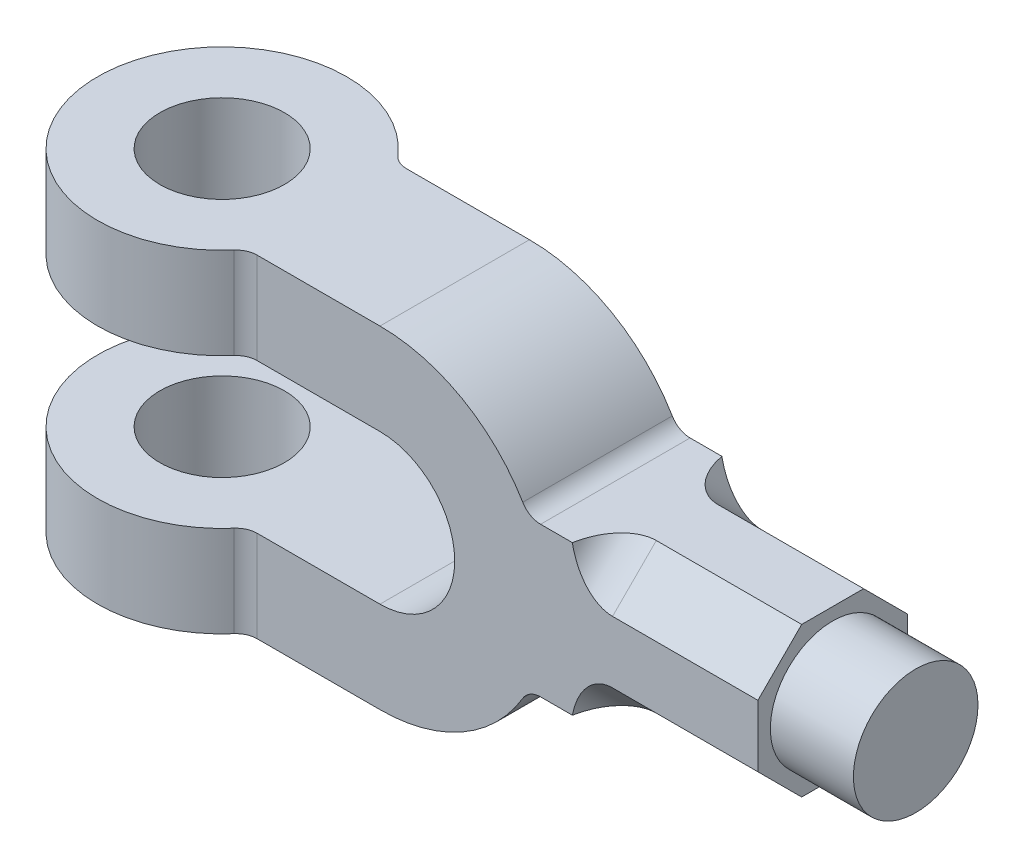
ISO-10303-21;
HEADER;
FILE_DESCRIPTION(('STEP AP214'),'2;1');
FILE_NAME('part.step','',(''),(''),'','','');
FILE_SCHEMA(('AUTOMOTIVE_DESIGN { 1 0 10303 214 1 1 1 1 }'));
ENDSEC;
DATA;
#1=APPLICATION_CONTEXT('core data for automotive mechanical design processes');
#2=APPLICATION_PROTOCOL_DEFINITION('international standard','automotive_design',2000,#1);
#3=PRODUCT_CONTEXT('',#1,'mechanical');
#4=PRODUCT('Part','Part','',(#3));
#5=PRODUCT_RELATED_PRODUCT_CATEGORY('part','',(#4));
#6=PRODUCT_DEFINITION_FORMATION('','',#4);
#7=PRODUCT_DEFINITION_CONTEXT('part definition',#1,'design');
#8=PRODUCT_DEFINITION('design','',#6,#7);
#9=PRODUCT_DEFINITION_SHAPE('','',#8);
#10=(LENGTH_UNIT() NAMED_UNIT(*) SI_UNIT(.MILLI.,.METRE.));
#11=(NAMED_UNIT(*) PLANE_ANGLE_UNIT() SI_UNIT($,.RADIAN.));
#12=(NAMED_UNIT(*) SI_UNIT($,.STERADIAN.) SOLID_ANGLE_UNIT());
#13=UNCERTAINTY_MEASURE_WITH_UNIT(LENGTH_MEASURE(1.E-05),#10,'distance_accuracy_value','');
#14=(GEOMETRIC_REPRESENTATION_CONTEXT(3) GLOBAL_UNCERTAINTY_ASSIGNED_CONTEXT((#13)) GLOBAL_UNIT_ASSIGNED_CONTEXT((#10,
#11,#12)) REPRESENTATION_CONTEXT('',''));
#15=CARTESIAN_POINT('',(0.,0.,0.));
#16=DIRECTION('',(0.,0.,1.));
#17=DIRECTION('',(1.,0.,0.));
#18=AXIS2_PLACEMENT_3D('',#15,#16,#17);
#19=CARTESIAN_POINT('',(24.,40.,18.));
#20=DIRECTION('',(0.,0.,-1.));
#21=DIRECTION('',(-1.,0.,0.));
#22=AXIS2_PLACEMENT_3D('',#19,#20,#21);
#23=PLANE('',#22);
#24=DIRECTION('',(-1.,0.,0.));
#25=VECTOR('',#24,1.);
#26=CARTESIAN_POINT('',(24.,-18.,18.));
#27=LINE('',#26,#25);
#28=CARTESIAN_POINT('',(56.,-18.,18.));
#29=VERTEX_POINT('',#28);
#30=CARTESIAN_POINT('',(26.3818119165458,-18.,18.));
#31=VERTEX_POINT('',#30);
#32=EDGE_CURVE('E297',#29,#31,#27,.T.);
#33=ORIENTED_EDGE('',*,*,#32,.T.);
#34=DIRECTION('',(0.,1.,0.));
#35=VECTOR('',#34,1.);
#36=CARTESIAN_POINT('',(26.3818119165458,-40.,18.));
#37=LINE('',#36,#35);
#38=CARTESIAN_POINT('',(26.3818119165458,-40.,18.));
#39=VERTEX_POINT('',#38);
#40=EDGE_CURVE('E385',#31,#39,#37,.F.);
#41=ORIENTED_EDGE('',*,*,#40,.T.);
#42=DIRECTION('',(1.,0.,0.));
#43=VECTOR('',#42,1.);
#44=CARTESIAN_POINT('',(24.,-40.,18.));
#45=LINE('',#44,#43);
#46=CARTESIAN_POINT('',(56.,-40.,18.));
#47=VERTEX_POINT('',#46);
#48=EDGE_CURVE('E320',#39,#47,#45,.T.);
#49=ORIENTED_EDGE('',*,*,#48,.T.);
#50=CARTESIAN_POINT('',(56.,0.,18.));
#51=DIRECTION('',(0.,0.,1.));
#52=DIRECTION('',(-1.,0.,0.));
#53=AXIS2_PLACEMENT_3D('',#50,#51,#52);
#54=CIRCLE('',#53,40.);
#55=CARTESIAN_POINT('',(90.380585965891,-20.4444444444444,18.));
#56=VERTEX_POINT('',#55);
#57=EDGE_CURVE('E281',#47,#56,#54,.T.);
#58=ORIENTED_EDGE('',*,*,#57,.T.);
#59=CARTESIAN_POINT('',(94.6781592116274,-23.,18.));
#60=DIRECTION('',(0.,0.,-1.));
#61=DIRECTION('',(-1.,0.,0.));
#62=AXIS2_PLACEMENT_3D('',#59,#60,#61);
#63=CIRCLE('',#62,5.);
#64=CARTESIAN_POINT('',(94.6781592116274,-18.,18.));
#65=VERTEX_POINT('',#64);
#66=EDGE_CURVE('E369',#56,#65,#63,.T.);
#67=ORIENTED_EDGE('',*,*,#66,.T.);
#68=DIRECTION('',(1.,0.,0.));
#69=VECTOR('',#68,1.);
#70=CARTESIAN_POINT('',(91.7211421989835,-18.,18.));
#71=LINE('',#70,#69);
#72=CARTESIAN_POINT('',(102.329050156676,-18.,18.));
#73=VERTEX_POINT('',#72);
#74=EDGE_CURVE('E284',#65,#73,#71,.T.);
#75=ORIENTED_EDGE('',*,*,#74,.T.);
#76=CARTESIAN_POINT('',(112.,-21.5979797464467,18.));
#77=DIRECTION('',(0.,0.,-1.));
#78=DIRECTION('',(0.,-1.,0.));
#79=AXIS2_PLACEMENT_3D('',#76,#77,#78);
#80=ELLIPSE('',#79,14.1421356237309,10.);
#81=CARTESIAN_POINT('',(112.,-7.45584412271571,18.));
#82=VERTEX_POINT('',#81);
#83=EDGE_CURVE('E353',#73,#82,#80,.T.);
#84=ORIENTED_EDGE('',*,*,#83,.T.);
#85=DIRECTION('',(-1.,0.,0.));
#86=VECTOR('',#85,1.);
#87=CARTESIAN_POINT('',(147.,-7.45584412271571,18.));
#88=LINE('',#87,#86);
#89=CARTESIAN_POINT('',(147.,-7.45584412271571,18.));
#90=VERTEX_POINT('',#89);
#91=EDGE_CURVE('E245',#90,#82,#88,.T.);
#92=ORIENTED_EDGE('',*,*,#91,.F.);
#93=DIRECTION('',(0.,-1.,0.));
#94=VECTOR('',#93,1.);
#95=CARTESIAN_POINT('',(147.,7.45584412271571,18.));
#96=LINE('',#95,#94);
#97=CARTESIAN_POINT('',(147.,7.45584412271571,18.));
#98=VERTEX_POINT('',#97);
#99=EDGE_CURVE('E224',#98,#90,#96,.T.);
#100=ORIENTED_EDGE('',*,*,#99,.F.);
#101=DIRECTION('',(-1.,0.,0.));
#102=VECTOR('',#101,1.);
#103=CARTESIAN_POINT('',(147.,7.45584412271571,18.));
#104=LINE('',#103,#102);
#105=CARTESIAN_POINT('',(112.,7.45584412271571,18.));
#106=VERTEX_POINT('',#105);
#107=EDGE_CURVE('E221',#98,#106,#104,.T.);
#108=ORIENTED_EDGE('',*,*,#107,.T.);
#109=CARTESIAN_POINT('',(112.,21.5979797464467,18.));
#110=DIRECTION('',(0.,0.,-1.));
#111=DIRECTION('',(0.,-1.,0.));
#112=AXIS2_PLACEMENT_3D('',#109,#110,#111);
#113=ELLIPSE('',#112,14.142135623731,10.);
#114=CARTESIAN_POINT('',(102.329050156676,18.,18.));
#115=VERTEX_POINT('',#114);
#116=EDGE_CURVE('E336',#106,#115,#113,.T.);
#117=ORIENTED_EDGE('',*,*,#116,.T.);
#118=DIRECTION('',(-1.,0.,0.));
#119=VECTOR('',#118,1.);
#120=CARTESIAN_POINT('',(91.7211421989835,18.,18.));
#121=LINE('',#120,#119);
#122=CARTESIAN_POINT('',(94.6781592116274,18.,18.));
#123=VERTEX_POINT('',#122);
#124=EDGE_CURVE('E286',#115,#123,#121,.T.);
#125=ORIENTED_EDGE('',*,*,#124,.T.);
#126=CARTESIAN_POINT('',(94.6781592116274,23.,18.));
#127=DIRECTION('',(0.,0.,-1.));
#128=DIRECTION('',(-1.,0.,0.));
#129=AXIS2_PLACEMENT_3D('',#126,#127,#128);
#130=CIRCLE('',#129,5.);
#131=CARTESIAN_POINT('',(90.380585965891,20.4444444444444,18.));
#132=VERTEX_POINT('',#131);
#133=EDGE_CURVE('E365',#123,#132,#130,.T.);
#134=ORIENTED_EDGE('',*,*,#133,.T.);
#135=CARTESIAN_POINT('',(56.,0.,18.));
#136=DIRECTION('',(0.,0.,1.));
#137=DIRECTION('',(-1.,0.,0.));
#138=AXIS2_PLACEMENT_3D('',#135,#136,#137);
#139=CIRCLE('',#138,40.);
#140=CARTESIAN_POINT('',(56.,40.,18.));
#141=VERTEX_POINT('',#140);
#142=EDGE_CURVE('E269',#132,#141,#139,.T.);
#143=ORIENTED_EDGE('',*,*,#142,.T.);
#144=DIRECTION('',(1.,0.,0.));
#145=VECTOR('',#144,1.);
#146=CARTESIAN_POINT('',(24.,40.,18.));
#147=LINE('',#146,#145);
#148=CARTESIAN_POINT('',(26.3818119165458,40.,18.));
#149=VERTEX_POINT('',#148);
#150=EDGE_CURVE('E253',#149,#141,#147,.T.);
#151=ORIENTED_EDGE('',*,*,#150,.F.);
#152=DIRECTION('',(0.,1.,0.));
#153=VECTOR('',#152,1.);
#154=CARTESIAN_POINT('',(26.3818119165458,18.,18.));
#155=LINE('',#154,#153);
#156=CARTESIAN_POINT('',(26.3818119165458,18.,18.));
#157=VERTEX_POINT('',#156);
#158=EDGE_CURVE('E382',#149,#157,#155,.F.);
#159=ORIENTED_EDGE('',*,*,#158,.T.);
#160=DIRECTION('',(1.,0.,0.));
#161=VECTOR('',#160,1.);
#162=CARTESIAN_POINT('',(24.,18.,18.));
#163=LINE('',#162,#161);
#164=CARTESIAN_POINT('',(56.,18.,18.));
#165=VERTEX_POINT('',#164);
#166=EDGE_CURVE('E261',#157,#165,#163,.T.);
#167=ORIENTED_EDGE('',*,*,#166,.T.);
#168=CARTESIAN_POINT('',(56.,0.,18.));
#169=DIRECTION('',(0.,0.,-1.));
#170=DIRECTION('',(-1.,0.,0.));
#171=AXIS2_PLACEMENT_3D('',#168,#169,#170);
#172=CIRCLE('',#171,18.);
#173=EDGE_CURVE('E252',#165,#29,#172,.T.);
#174=ORIENTED_EDGE('',*,*,#173,.T.);
#175=EDGE_LOOP('',(#33,#41,#49,#58,#67,#75,#84,#92,#100,#108,#117,#125,#134,#143,#151,#159,#167,#174));
#176=FACE_BOUND('',#175,.T.);
#177=ADVANCED_FACE('F39',(#176),#23,.F.);
#178=CARTESIAN_POINT('',(0.,40.,0.));
#179=DIRECTION('',(0.,-1.,0.));
#180=DIRECTION('',(0.,0.,-1.));
#181=AXIS2_PLACEMENT_3D('',#178,#179,#180);
#182=CYLINDRICAL_SURFACE('',#181,30.);
#183=CARTESIAN_POINT('',(0.,-18.,0.));
#184=DIRECTION('',(0.,-1.,0.));
#185=DIRECTION('',(0.,0.,-1.));
#186=AXIS2_PLACEMENT_3D('',#183,#184,#185);
#187=CIRCLE('',#186,30.);
#188=CARTESIAN_POINT('',(22.6129816427536,-18.,19.7142857142857));
#189=VERTEX_POINT('',#188);
#190=CARTESIAN_POINT('',(22.6129816427536,-18.,-19.7142857142857));
#191=VERTEX_POINT('',#190);
#192=EDGE_CURVE('E300',#189,#191,#187,.T.);
#193=ORIENTED_EDGE('',*,*,#192,.T.);
#194=DIRECTION('',(0.,-1.,0.));
#195=VECTOR('',#194,1.);
#196=CARTESIAN_POINT('',(22.6129816427536,40.,-19.7142857142857));
#197=LINE('',#196,#195);
#198=CARTESIAN_POINT('',(22.6129816427536,-40.,-19.7142857142857));
#199=VERTEX_POINT('',#198);
#200=EDGE_CURVE('E375',#191,#199,#197,.T.);
#201=ORIENTED_EDGE('',*,*,#200,.T.);
#202=CARTESIAN_POINT('',(0.,-40.,0.));
#203=DIRECTION('',(0.,1.,0.));
#204=DIRECTION('',(0.,0.,1.));
#205=AXIS2_PLACEMENT_3D('',#202,#203,#204);
#206=CIRCLE('',#205,30.);
#207=CARTESIAN_POINT('',(22.6129816427536,-40.,19.7142857142857));
#208=VERTEX_POINT('',#207);
#209=EDGE_CURVE('E317',#199,#208,#206,.T.);
#210=ORIENTED_EDGE('',*,*,#209,.T.);
#211=DIRECTION('',(0.,-1.,0.));
#212=VECTOR('',#211,1.);
#213=CARTESIAN_POINT('',(22.6129816427536,40.,19.7142857142857));
#214=LINE('',#213,#212);
#215=EDGE_CURVE('E373',#208,#189,#214,.F.);
#216=ORIENTED_EDGE('',*,*,#215,.T.);
#217=EDGE_LOOP('',(#193,#201,#210,#216));
#218=FACE_BOUND('',#217,.T.);
#219=ADVANCED_FACE('F447',(#218),#182,.T.);
#220=CARTESIAN_POINT('',(24.,40.,-18.));
#221=DIRECTION('',(0.,0.,1.));
#222=DIRECTION('',(1.,0.,0.));
#223=AXIS2_PLACEMENT_3D('',#220,#221,#222);
#224=PLANE('',#223);
#225=DIRECTION('',(-1.,0.,0.));
#226=VECTOR('',#225,1.);
#227=CARTESIAN_POINT('',(24.,-40.,-18.));
#228=LINE('',#227,#226);
#229=CARTESIAN_POINT('',(56.,-40.,-18.));
#230=VERTEX_POINT('',#229);
#231=CARTESIAN_POINT('',(26.3818119165458,-40.,-18.));
#232=VERTEX_POINT('',#231);
#233=EDGE_CURVE('E314',#230,#232,#228,.T.);
#234=ORIENTED_EDGE('',*,*,#233,.T.);
#235=DIRECTION('',(0.,1.,0.));
#236=VECTOR('',#235,1.);
#237=CARTESIAN_POINT('',(26.3818119165458,-18.,-18.));
#238=LINE('',#237,#236);
#239=CARTESIAN_POINT('',(26.3818119165458,-18.,-18.));
#240=VERTEX_POINT('',#239);
#241=EDGE_CURVE('E380',#232,#240,#238,.T.);
#242=ORIENTED_EDGE('',*,*,#241,.T.);
#243=DIRECTION('',(1.,0.,0.));
#244=VECTOR('',#243,1.);
#245=CARTESIAN_POINT('',(24.,-18.,-18.));
#246=LINE('',#245,#244);
#247=CARTESIAN_POINT('',(56.,-18.,-18.));
#248=VERTEX_POINT('',#247);
#249=EDGE_CURVE('E303',#240,#248,#246,.T.);
#250=ORIENTED_EDGE('',*,*,#249,.T.);
#251=CARTESIAN_POINT('',(56.,0.,-18.));
#252=DIRECTION('',(0.,0.,-1.));
#253=DIRECTION('',(-1.,0.,0.));
#254=AXIS2_PLACEMENT_3D('',#251,#252,#253);
#255=CIRCLE('',#254,18.);
#256=CARTESIAN_POINT('',(56.,18.,-18.));
#257=VERTEX_POINT('',#256);
#258=EDGE_CURVE('E265',#257,#248,#255,.T.);
#259=ORIENTED_EDGE('',*,*,#258,.F.);
#260=DIRECTION('',(-1.,0.,0.));
#261=VECTOR('',#260,1.);
#262=CARTESIAN_POINT('',(24.,18.,-18.));
#263=LINE('',#262,#261);
#264=CARTESIAN_POINT('',(26.3818119165458,18.,-18.));
#265=VERTEX_POINT('',#264);
#266=EDGE_CURVE('E240',#257,#265,#263,.T.);
#267=ORIENTED_EDGE('',*,*,#266,.T.);
#268=DIRECTION('',(0.,1.,0.));
#269=VECTOR('',#268,1.);
#270=CARTESIAN_POINT('',(26.3818119165458,40.,-18.));
#271=LINE('',#270,#269);
#272=CARTESIAN_POINT('',(26.3818119165458,40.,-18.));
#273=VERTEX_POINT('',#272);
#274=EDGE_CURVE('E378',#265,#273,#271,.T.);
#275=ORIENTED_EDGE('',*,*,#274,.T.);
#276=DIRECTION('',(-1.,0.,0.));
#277=VECTOR('',#276,1.);
#278=CARTESIAN_POINT('',(24.,40.,-18.));
#279=LINE('',#278,#277);
#280=CARTESIAN_POINT('',(56.,40.,-18.));
#281=VERTEX_POINT('',#280);
#282=EDGE_CURVE('E257',#281,#273,#279,.T.);
#283=ORIENTED_EDGE('',*,*,#282,.F.);
#284=CARTESIAN_POINT('',(56.,0.,-18.));
#285=DIRECTION('',(0.,0.,1.));
#286=DIRECTION('',(-1.,0.,0.));
#287=AXIS2_PLACEMENT_3D('',#284,#285,#286);
#288=CIRCLE('',#287,40.);
#289=CARTESIAN_POINT('',(90.380585965891,20.4444444444444,-18.));
#290=VERTEX_POINT('',#289);
#291=EDGE_CURVE('E276',#290,#281,#288,.T.);
#292=ORIENTED_EDGE('',*,*,#291,.F.);
#293=CARTESIAN_POINT('',(94.6781592116274,23.,-18.));
#294=DIRECTION('',(0.,0.,1.));
#295=DIRECTION('',(1.,0.,0.));
#296=AXIS2_PLACEMENT_3D('',#293,#294,#295);
#297=CIRCLE('',#296,5.);
#298=CARTESIAN_POINT('',(94.6781592116274,18.,-18.));
#299=VERTEX_POINT('',#298);
#300=EDGE_CURVE('E367',#290,#299,#297,.T.);
#301=ORIENTED_EDGE('',*,*,#300,.T.);
#302=DIRECTION('',(-1.,0.,0.));
#303=VECTOR('',#302,1.);
#304=CARTESIAN_POINT('',(91.7211421989835,18.,-18.));
#305=LINE('',#304,#303);
#306=CARTESIAN_POINT('',(102.329050156676,18.,-18.));
#307=VERTEX_POINT('',#306);
#308=EDGE_CURVE('E274',#307,#299,#305,.T.);
#309=ORIENTED_EDGE('',*,*,#308,.F.);
#310=CARTESIAN_POINT('',(112.,21.5979797464467,-18.));
#311=DIRECTION('',(0.,0.,1.));
#312=DIRECTION('',(0.,1.,0.));
#313=AXIS2_PLACEMENT_3D('',#310,#311,#312);
#314=ELLIPSE('',#313,14.1421356237309,10.);
#315=CARTESIAN_POINT('',(112.,7.45584412271571,-18.));
#316=VERTEX_POINT('',#315);
#317=EDGE_CURVE('E343',#307,#316,#314,.T.);
#318=ORIENTED_EDGE('',*,*,#317,.T.);
#319=DIRECTION('',(-1.,0.,0.));
#320=VECTOR('',#319,1.);
#321=CARTESIAN_POINT('',(147.,7.45584412271571,-18.));
#322=LINE('',#321,#320);
#323=CARTESIAN_POINT('',(147.,7.45584412271571,-18.));
#324=VERTEX_POINT('',#323);
#325=EDGE_CURVE('E489',#324,#316,#322,.T.);
#326=ORIENTED_EDGE('',*,*,#325,.F.);
#327=DIRECTION('',(0.,1.,0.));
#328=VECTOR('',#327,1.);
#329=CARTESIAN_POINT('',(147.,-7.45584412271571,-18.));
#330=LINE('',#329,#328);
#331=CARTESIAN_POINT('',(147.,-7.45584412271571,-18.));
#332=VERTEX_POINT('',#331);
#333=EDGE_CURVE('E495',#332,#324,#330,.T.);
#334=ORIENTED_EDGE('',*,*,#333,.F.);
#335=DIRECTION('',(-1.,0.,0.));
#336=VECTOR('',#335,1.);
#337=CARTESIAN_POINT('',(147.,-7.45584412271571,-18.));
#338=LINE('',#337,#336);
#339=CARTESIAN_POINT('',(112.,-7.45584412271571,-18.));
#340=VERTEX_POINT('',#339);
#341=EDGE_CURVE('E486',#332,#340,#338,.T.);
#342=ORIENTED_EDGE('',*,*,#341,.T.);
#343=CARTESIAN_POINT('',(112.,-21.5979797464467,-18.));
#344=DIRECTION('',(0.,0.,1.));
#345=DIRECTION('',(0.,1.,0.));
#346=AXIS2_PLACEMENT_3D('',#343,#344,#345);
#347=ELLIPSE('',#346,14.142135623731,10.);
#348=CARTESIAN_POINT('',(102.329050156676,-18.,-18.));
#349=VERTEX_POINT('',#348);
#350=EDGE_CURVE('E345',#340,#349,#347,.T.);
#351=ORIENTED_EDGE('',*,*,#350,.T.);
#352=DIRECTION('',(1.,0.,0.));
#353=VECTOR('',#352,1.);
#354=CARTESIAN_POINT('',(91.7211421989835,-18.,-18.));
#355=LINE('',#354,#353);
#356=CARTESIAN_POINT('',(94.6781592116274,-18.,-18.));
#357=VERTEX_POINT('',#356);
#358=EDGE_CURVE('E272',#357,#349,#355,.T.);
#359=ORIENTED_EDGE('',*,*,#358,.F.);
#360=CARTESIAN_POINT('',(94.6781592116274,-23.,-18.));
#361=DIRECTION('',(0.,0.,1.));
#362=DIRECTION('',(1.,0.,0.));
#363=AXIS2_PLACEMENT_3D('',#360,#361,#362);
#364=CIRCLE('',#363,5.);
#365=CARTESIAN_POINT('',(90.380585965891,-20.4444444444444,-18.));
#366=VERTEX_POINT('',#365);
#367=EDGE_CURVE('E371',#357,#366,#364,.T.);
#368=ORIENTED_EDGE('',*,*,#367,.T.);
#369=CARTESIAN_POINT('',(56.,0.,-18.));
#370=DIRECTION('',(0.,0.,1.));
#371=DIRECTION('',(-1.,0.,0.));
#372=AXIS2_PLACEMENT_3D('',#369,#370,#371);
#373=CIRCLE('',#372,40.);
#374=EDGE_CURVE('E268',#230,#366,#373,.T.);
#375=ORIENTED_EDGE('',*,*,#374,.F.);
#376=EDGE_LOOP('',(#234,#242,#250,#259,#267,#275,#283,#292,#301,#309,#318,#326,#334,#342,#351,
#359,#368,#375));
#377=FACE_BOUND('',#376,.T.);
#378=ADVANCED_FACE('F428',(#377),#224,.F.);
#379=CARTESIAN_POINT('',(0.,-40.,0.));
#380=DIRECTION('',(0.,1.,0.));
#381=DIRECTION('',(0.,0.,1.));
#382=AXIS2_PLACEMENT_3D('',#379,#380,#381);
#383=PLANE('',#382);
#384=DIRECTION('',(0.,0.,-1.));
#385=VECTOR('',#384,1.);
#386=CARTESIAN_POINT('',(56.,-40.,18.));
#387=LINE('',#386,#385);
#388=EDGE_CURVE('E311',#47,#230,#387,.T.);
#389=ORIENTED_EDGE('',*,*,#388,.F.);
#390=ORIENTED_EDGE('',*,*,#48,.F.);
#391=CARTESIAN_POINT('',(26.3818119165458,-40.,23.));
#392=DIRECTION('',(0.,1.,0.));
#393=DIRECTION('',(0.,0.,1.));
#394=AXIS2_PLACEMENT_3D('',#391,#392,#393);
#395=CIRCLE('',#394,5.);
#396=EDGE_CURVE('E396',#39,#208,#395,.T.);
#397=ORIENTED_EDGE('',*,*,#396,.T.);
#398=ORIENTED_EDGE('',*,*,#209,.F.);
#399=CARTESIAN_POINT('',(26.3818119165458,-40.,-23.));
#400=DIRECTION('',(0.,1.,0.));
#401=DIRECTION('',(0.,0.,1.));
#402=AXIS2_PLACEMENT_3D('',#399,#400,#401);
#403=CIRCLE('',#402,5.);
#404=EDGE_CURVE('E392',#199,#232,#403,.T.);
#405=ORIENTED_EDGE('',*,*,#404,.T.);
#406=ORIENTED_EDGE('',*,*,#233,.F.);
#407=EDGE_LOOP('',(#389,#390,#397,#398,#405,#406));
#408=FACE_BOUND('',#407,.T.);
#409=CARTESIAN_POINT('',(0.,-40.,0.));
#410=DIRECTION('',(0.,1.,0.));
#411=DIRECTION('',(0.,0.,1.));
#412=AXIS2_PLACEMENT_3D('',#409,#410,#411);
#413=CIRCLE('',#412,15.);
#414=CARTESIAN_POINT('',(0.,-40.,15.));
#415=VERTEX_POINT('',#414);
#416=EDGE_CURVE('E308',#415,#415,#413,.T.);
#417=ORIENTED_EDGE('',*,*,#416,.T.);
#418=EDGE_LOOP('',(#417));
#419=FACE_BOUND('',#418,.T.);
#420=ADVANCED_FACE('F444',(#408,#419),#383,.F.);
#421=CARTESIAN_POINT('',(0.,40.,0.));
#422=DIRECTION('',(0.,-1.,0.));
#423=DIRECTION('',(0.,0.,-1.));
#424=AXIS2_PLACEMENT_3D('',#421,#422,#423);
#425=CYLINDRICAL_SURFACE('',#424,15.);
#426=CARTESIAN_POINT('',(0.,-18.,0.));
#427=DIRECTION('',(0.,-1.,0.));
#428=DIRECTION('',(0.,0.,-1.));
#429=AXIS2_PLACEMENT_3D('',#426,#427,#428);
#430=CIRCLE('',#429,15.);
#431=CARTESIAN_POINT('',(0.,-18.,-15.));
#432=VERTEX_POINT('',#431);
#433=EDGE_CURVE('E294',#432,#432,#430,.T.);
#434=ORIENTED_EDGE('',*,*,#433,.F.);
#435=EDGE_LOOP('',(#434));
#436=FACE_BOUND('',#435,.T.);
#437=ORIENTED_EDGE('',*,*,#416,.F.);
#438=EDGE_LOOP('',(#437));
#439=FACE_BOUND('',#438,.T.);
#440=ADVANCED_FACE('F768',(#436,#439),#425,.F.);
#441=CARTESIAN_POINT('',(-34.1569577348162,-18.,-40.));
#442=DIRECTION('',(0.,-1.,0.));
#443=DIRECTION('',(0.,0.,-1.));
#444=AXIS2_PLACEMENT_3D('',#441,#442,#443);
#445=PLANE('',#444);
#446=ORIENTED_EDGE('',*,*,#433,.T.);
#447=EDGE_LOOP('',(#446));
#448=FACE_BOUND('',#447,.T.);
#449=ORIENTED_EDGE('',*,*,#249,.F.);
#450=CARTESIAN_POINT('',(26.3818119165458,-18.,-23.));
#451=DIRECTION('',(0.,-1.,0.));
#452=DIRECTION('',(0.,0.,-1.));
#453=AXIS2_PLACEMENT_3D('',#450,#451,#452);
#454=CIRCLE('',#453,5.);
#455=EDGE_CURVE('E394',#240,#191,#454,.T.);
#456=ORIENTED_EDGE('',*,*,#455,.T.);
#457=ORIENTED_EDGE('',*,*,#192,.F.);
#458=CARTESIAN_POINT('',(26.3818119165458,-18.,23.));
#459=DIRECTION('',(0.,-1.,0.));
#460=DIRECTION('',(0.,0.,-1.));
#461=AXIS2_PLACEMENT_3D('',#458,#459,#460);
#462=CIRCLE('',#461,5.);
#463=EDGE_CURVE('E398',#189,#31,#462,.T.);
#464=ORIENTED_EDGE('',*,*,#463,.T.);
#465=ORIENTED_EDGE('',*,*,#32,.F.);
#466=DIRECTION('',(0.,0.,1.));
#467=VECTOR('',#466,1.);
#468=CARTESIAN_POINT('',(56.,-18.,18.));
#469=LINE('',#468,#467);
#470=EDGE_CURVE('E305',#248,#29,#469,.T.);
#471=ORIENTED_EDGE('',*,*,#470,.F.);
#472=EDGE_LOOP('',(#449,#456,#457,#464,#465,#471));
#473=FACE_BOUND('',#472,.T.);
#474=ADVANCED_FACE('F730',(#448,#473),#445,.F.);
#475=CARTESIAN_POINT('',(56.,0.,-18.));
#476=DIRECTION('',(0.,0.,1.));
#477=DIRECTION('',(1.,0.,0.));
#478=AXIS2_PLACEMENT_3D('',#475,#476,#477);
#479=CYLINDRICAL_SURFACE('',#478,18.);
#480=ORIENTED_EDGE('',*,*,#173,.F.);
#481=DIRECTION('',(0.,0.,1.));
#482=VECTOR('',#481,1.);
#483=CARTESIAN_POINT('',(56.,18.,-18.));
#484=LINE('',#483,#482);
#485=EDGE_CURVE('E291',#257,#165,#484,.T.);
#486=ORIENTED_EDGE('',*,*,#485,.F.);
#487=ORIENTED_EDGE('',*,*,#258,.T.);
#488=ORIENTED_EDGE('',*,*,#470,.T.);
#489=EDGE_LOOP('',(#480,#486,#487,#488));
#490=FACE_BOUND('',#489,.T.);
#491=ADVANCED_FACE('F433',(#490),#479,.F.);
#492=CARTESIAN_POINT('',(56.,0.,-18.));
#493=DIRECTION('',(0.,0.,1.));
#494=DIRECTION('',(1.,0.,0.));
#495=AXIS2_PLACEMENT_3D('',#492,#493,#494);
#496=CYLINDRICAL_SURFACE('',#495,40.);
#497=ORIENTED_EDGE('',*,*,#142,.F.);
#498=DIRECTION('',(0.,0.,1.));
#499=VECTOR('',#498,1.);
#500=CARTESIAN_POINT('',(90.380585965891,20.4444444444445,-18.));
#501=LINE('',#500,#499);
#502=EDGE_CURVE('E358',#132,#290,#501,.F.);
#503=ORIENTED_EDGE('',*,*,#502,.T.);
#504=ORIENTED_EDGE('',*,*,#291,.T.);
#505=DIRECTION('',(0.,0.,1.));
#506=VECTOR('',#505,1.);
#507=CARTESIAN_POINT('',(56.,40.,-18.));
#508=LINE('',#507,#506);
#509=EDGE_CURVE('E278',#281,#141,#508,.T.);
#510=ORIENTED_EDGE('',*,*,#509,.T.);
#511=EDGE_LOOP('',(#497,#503,#504,#510));
#512=FACE_BOUND('',#511,.T.);
#513=ADVANCED_FACE('F419',(#512),#496,.T.);
#514=CARTESIAN_POINT('',(91.7211421989835,18.,-18.));
#515=DIRECTION('',(0.,1.,0.));
#516=DIRECTION('',(0.,0.,1.));
#517=AXIS2_PLACEMENT_3D('',#514,#515,#516);
#518=PLANE('',#517);
#519=ORIENTED_EDGE('',*,*,#308,.T.);
#520=DIRECTION('',(0.,0.,-1.));
#521=VECTOR('',#520,1.);
#522=CARTESIAN_POINT('',(94.6781592116274,18.,18.));
#523=LINE('',#522,#521);
#524=EDGE_CURVE('E355',#299,#123,#523,.F.);
#525=ORIENTED_EDGE('',*,*,#524,.T.);
#526=ORIENTED_EDGE('',*,*,#124,.F.);
#527=CARTESIAN_POINT('',(112.,18.,21.5979797464467));
#528=DIRECTION('',(0.,1.,0.));
#529=DIRECTION('',(0.,0.,1.));
#530=AXIS2_PLACEMENT_3D('',#527,#528,#529);
#531=ELLIPSE('',#530,14.1421356237309,10.);
#532=CARTESIAN_POINT('',(112.,18.,7.45584412271571));
#533=VERTEX_POINT('',#532);
#534=EDGE_CURVE('E239',#115,#533,#531,.F.);
#535=ORIENTED_EDGE('',*,*,#534,.T.);
#536=DIRECTION('',(-1.,0.,0.));
#537=VECTOR('',#536,1.);
#538=CARTESIAN_POINT('',(147.,18.,7.45584412271571));
#539=LINE('',#538,#537);
#540=CARTESIAN_POINT('',(147.,18.,7.45584412271571));
#541=VERTEX_POINT('',#540);
#542=EDGE_CURVE('E218',#541,#533,#539,.T.);
#543=ORIENTED_EDGE('',*,*,#542,.F.);
#544=DIRECTION('',(0.,0.,1.));
#545=VECTOR('',#544,1.);
#546=CARTESIAN_POINT('',(147.,18.,-7.45584412271571));
#547=LINE('',#546,#545);
#548=CARTESIAN_POINT('',(147.,18.,-7.45584412271571));
#549=VERTEX_POINT('',#548);
#550=EDGE_CURVE('E225',#549,#541,#547,.T.);
#551=ORIENTED_EDGE('',*,*,#550,.F.);
#552=DIRECTION('',(-1.,0.,0.));
#553=VECTOR('',#552,1.);
#554=CARTESIAN_POINT('',(147.,18.,-7.45584412271571));
#555=LINE('',#554,#553);
#556=CARTESIAN_POINT('',(112.,18.,-7.45584412271571));
#557=VERTEX_POINT('',#556);
#558=EDGE_CURVE('E492',#549,#557,#555,.T.);
#559=ORIENTED_EDGE('',*,*,#558,.T.);
#560=CARTESIAN_POINT('',(112.,18.,-21.5979797464467));
#561=DIRECTION('',(0.,1.,0.));
#562=DIRECTION('',(0.,0.,1.));
#563=AXIS2_PLACEMENT_3D('',#560,#561,#562);
#564=ELLIPSE('',#563,14.1421356237309,10.);
#565=EDGE_CURVE('E340',#557,#307,#564,.F.);
#566=ORIENTED_EDGE('',*,*,#565,.T.);
#567=EDGE_LOOP('',(#519,#525,#526,#535,#543,#551,#559,#566));
#568=FACE_BOUND('',#567,.T.);
#569=ADVANCED_FACE('F237',(#568),#518,.T.);
#570=CARTESIAN_POINT('',(91.7211421989835,-18.,-18.));
#571=DIRECTION('',(0.,-1.,0.));
#572=DIRECTION('',(1.,0.,0.));
#573=AXIS2_PLACEMENT_3D('',#570,#571,#572);
#574=PLANE('',#573);
#575=ORIENTED_EDGE('',*,*,#74,.F.);
#576=DIRECTION('',(0.,0.,-1.));
#577=VECTOR('',#576,1.);
#578=CARTESIAN_POINT('',(94.6781592116274,-18.,-18.));
#579=LINE('',#578,#577);
#580=EDGE_CURVE('E363',#65,#357,#579,.T.);
#581=ORIENTED_EDGE('',*,*,#580,.T.);
#582=ORIENTED_EDGE('',*,*,#358,.T.);
#583=CARTESIAN_POINT('',(112.,-18.,-21.5979797464467));
#584=DIRECTION('',(0.,-1.,0.));
#585=DIRECTION('',(0.,0.,-1.));
#586=AXIS2_PLACEMENT_3D('',#583,#584,#585);
#587=ELLIPSE('',#586,14.1421356237309,10.);
#588=CARTESIAN_POINT('',(112.,-18.,-7.45584412271572));
#589=VERTEX_POINT('',#588);
#590=EDGE_CURVE('E348',#349,#589,#587,.F.);
#591=ORIENTED_EDGE('',*,*,#590,.T.);
#592=DIRECTION('',(-1.,0.,0.));
#593=VECTOR('',#592,1.);
#594=CARTESIAN_POINT('',(147.,-18.,-7.45584412271572));
#595=LINE('',#594,#593);
#596=CARTESIAN_POINT('',(147.,-18.,-7.45584412271572));
#597=VERTEX_POINT('',#596);
#598=EDGE_CURVE('E481',#597,#589,#595,.T.);
#599=ORIENTED_EDGE('',*,*,#598,.F.);
#600=DIRECTION('',(0.,0.,-1.));
#601=VECTOR('',#600,1.);
#602=CARTESIAN_POINT('',(147.,-18.,7.45584412271571));
#603=LINE('',#602,#601);
#604=CARTESIAN_POINT('',(147.,-18.,7.45584412271571));
#605=VERTEX_POINT('',#604);
#606=EDGE_CURVE('E499',#605,#597,#603,.T.);
#607=ORIENTED_EDGE('',*,*,#606,.F.);
#608=DIRECTION('',(-1.,0.,0.));
#609=VECTOR('',#608,1.);
#610=CARTESIAN_POINT('',(147.,-18.,7.45584412271571));
#611=LINE('',#610,#609);
#612=CARTESIAN_POINT('',(112.,-18.,7.45584412271571));
#613=VERTEX_POINT('',#612);
#614=EDGE_CURVE('E471',#605,#613,#611,.T.);
#615=ORIENTED_EDGE('',*,*,#614,.T.);
#616=CARTESIAN_POINT('',(112.,-18.,21.5979797464467));
#617=DIRECTION('',(0.,-1.,0.));
#618=DIRECTION('',(0.,0.,-1.));
#619=AXIS2_PLACEMENT_3D('',#616,#617,#618);
#620=ELLIPSE('',#619,14.1421356237309,10.);
#621=EDGE_CURVE('E350',#613,#73,#620,.F.);
#622=ORIENTED_EDGE('',*,*,#621,.T.);
#623=EDGE_LOOP('',(#575,#581,#582,#591,#599,#607,#615,#622));
#624=FACE_BOUND('',#623,.T.);
#625=ADVANCED_FACE('F466',(#624),#574,.T.);
#626=CARTESIAN_POINT('',(56.,0.,-18.));
#627=DIRECTION('',(0.,0.,1.));
#628=DIRECTION('',(1.,0.,0.));
#629=AXIS2_PLACEMENT_3D('',#626,#627,#628);
#630=CYLINDRICAL_SURFACE('',#629,40.);
#631=ORIENTED_EDGE('',*,*,#374,.T.);
#632=DIRECTION('',(0.,0.,1.));
#633=VECTOR('',#632,1.);
#634=CARTESIAN_POINT('',(90.380585965891,-20.4444444444444,-18.));
#635=LINE('',#634,#633);
#636=EDGE_CURVE('E360',#366,#56,#635,.T.);
#637=ORIENTED_EDGE('',*,*,#636,.T.);
#638=ORIENTED_EDGE('',*,*,#57,.F.);
#639=ORIENTED_EDGE('',*,*,#388,.T.);
#640=EDGE_LOOP('',(#631,#637,#638,#639));
#641=FACE_BOUND('',#640,.T.);
#642=ADVANCED_FACE('F459',(#641),#630,.T.);
#643=CARTESIAN_POINT('',(0.,40.,0.));
#644=DIRECTION('',(0.,-1.,0.));
#645=DIRECTION('',(0.,0.,-1.));
#646=AXIS2_PLACEMENT_3D('',#643,#644,#645);
#647=CYLINDRICAL_SURFACE('',#646,30.);
#648=CARTESIAN_POINT('',(0.,40.,0.));
#649=DIRECTION('',(0.,1.,0.));
#650=DIRECTION('',(0.,0.,1.));
#651=AXIS2_PLACEMENT_3D('',#648,#649,#650);
#652=CIRCLE('',#651,30.);
#653=CARTESIAN_POINT('',(22.6129816427536,40.,-19.7142857142857));
#654=VERTEX_POINT('',#653);
#655=CARTESIAN_POINT('',(22.6129816427536,40.,19.7142857142857));
#656=VERTEX_POINT('',#655);
#657=EDGE_CURVE('E255',#654,#656,#652,.T.);
#658=ORIENTED_EDGE('',*,*,#657,.F.);
#659=DIRECTION('',(0.,-1.,0.));
#660=VECTOR('',#659,1.);
#661=CARTESIAN_POINT('',(22.6129816427536,40.,-19.7142857142857));
#662=LINE('',#661,#660);
#663=CARTESIAN_POINT('',(22.6129816427536,18.,-19.7142857142857));
#664=VERTEX_POINT('',#663);
#665=EDGE_CURVE('E389',#654,#664,#662,.T.);
#666=ORIENTED_EDGE('',*,*,#665,.T.);
#667=CARTESIAN_POINT('',(0.,18.,0.));
#668=DIRECTION('',(0.,1.,0.));
#669=DIRECTION('',(0.,0.,1.));
#670=AXIS2_PLACEMENT_3D('',#667,#668,#669);
#671=CIRCLE('',#670,30.);
#672=CARTESIAN_POINT('',(22.6129816427536,18.,19.7142857142857));
#673=VERTEX_POINT('',#672);
#674=EDGE_CURVE('E243',#664,#673,#671,.T.);
#675=ORIENTED_EDGE('',*,*,#674,.T.);
#676=DIRECTION('',(0.,-1.,0.));
#677=VECTOR('',#676,1.);
#678=CARTESIAN_POINT('',(22.6129816427536,40.,19.7142857142857));
#679=LINE('',#678,#677);
#680=EDGE_CURVE('E54',#673,#656,#679,.F.);
#681=ORIENTED_EDGE('',*,*,#680,.T.);
#682=EDGE_LOOP('',(#658,#666,#675,#681));
#683=FACE_BOUND('',#682,.T.);
#684=ADVANCED_FACE('F408',(#683),#647,.T.);
#685=CARTESIAN_POINT('',(0.,40.,0.));
#686=DIRECTION('',(0.,-1.,0.));
#687=DIRECTION('',(0.,0.,-1.));
#688=AXIS2_PLACEMENT_3D('',#685,#686,#687);
#689=CYLINDRICAL_SURFACE('',#688,15.);
#690=CARTESIAN_POINT('',(0.,18.,0.));
#691=DIRECTION('',(0.,1.,0.));
#692=DIRECTION('',(0.,0.,1.));
#693=AXIS2_PLACEMENT_3D('',#690,#691,#692);
#694=CIRCLE('',#693,15.);
#695=CARTESIAN_POINT('',(0.,18.,15.));
#696=VERTEX_POINT('',#695);
#697=EDGE_CURVE('E249',#696,#696,#694,.T.);
#698=ORIENTED_EDGE('',*,*,#697,.F.);
#699=EDGE_LOOP('',(#698));
#700=FACE_BOUND('',#699,.T.);
#701=CARTESIAN_POINT('',(0.,40.,0.));
#702=DIRECTION('',(0.,1.,0.));
#703=DIRECTION('',(0.,0.,1.));
#704=AXIS2_PLACEMENT_3D('',#701,#702,#703);
#705=CIRCLE('',#704,15.);
#706=CARTESIAN_POINT('',(0.,40.,15.));
#707=VERTEX_POINT('',#706);
#708=EDGE_CURVE('E259',#707,#707,#705,.T.);
#709=ORIENTED_EDGE('',*,*,#708,.T.);
#710=EDGE_LOOP('',(#709));
#711=FACE_BOUND('',#710,.T.);
#712=ADVANCED_FACE('F745',(#700,#711),#689,.F.);
#713=CARTESIAN_POINT('',(0.,40.,0.));
#714=DIRECTION('',(0.,1.,0.));
#715=DIRECTION('',(0.,0.,1.));
#716=AXIS2_PLACEMENT_3D('',#713,#714,#715);
#717=PLANE('',#716);
#718=ORIENTED_EDGE('',*,*,#509,.F.);
#719=ORIENTED_EDGE('',*,*,#282,.T.);
#720=CARTESIAN_POINT('',(26.3818119165458,40.,-23.));
#721=DIRECTION('',(0.,1.,0.));
#722=DIRECTION('',(0.,0.,1.));
#723=AXIS2_PLACEMENT_3D('',#720,#721,#722);
#724=CIRCLE('',#723,5.);
#725=EDGE_CURVE('E61',#273,#654,#724,.F.);
#726=ORIENTED_EDGE('',*,*,#725,.T.);
#727=ORIENTED_EDGE('',*,*,#657,.T.);
#728=CARTESIAN_POINT('',(26.3818119165458,40.,23.));
#729=DIRECTION('',(0.,1.,0.));
#730=DIRECTION('',(0.,0.,1.));
#731=AXIS2_PLACEMENT_3D('',#728,#729,#730);
#732=CIRCLE('',#731,5.);
#733=EDGE_CURVE('E11',#656,#149,#732,.F.);
#734=ORIENTED_EDGE('',*,*,#733,.T.);
#735=ORIENTED_EDGE('',*,*,#150,.T.);
#736=EDGE_LOOP('',(#718,#719,#726,#727,#734,#735));
#737=FACE_BOUND('',#736,.T.);
#738=ORIENTED_EDGE('',*,*,#708,.F.);
#739=EDGE_LOOP('',(#738));
#740=FACE_BOUND('',#739,.T.);
#741=ADVANCED_FACE('F413',(#737,#740),#717,.T.);
#742=CARTESIAN_POINT('',(-34.1569577348162,18.,-40.));
#743=DIRECTION('',(0.,1.,0.));
#744=DIRECTION('',(0.,0.,1.));
#745=AXIS2_PLACEMENT_3D('',#742,#743,#744);
#746=PLANE('',#745);
#747=ORIENTED_EDGE('',*,*,#697,.T.);
#748=EDGE_LOOP('',(#747));
#749=FACE_BOUND('',#748,.T.);
#750=ORIENTED_EDGE('',*,*,#166,.F.);
#751=CARTESIAN_POINT('',(26.3818119165458,18.,23.));
#752=DIRECTION('',(0.,1.,0.));
#753=DIRECTION('',(0.,0.,1.));
#754=AXIS2_PLACEMENT_3D('',#751,#752,#753);
#755=CIRCLE('',#754,5.);
#756=EDGE_CURVE('E47',#157,#673,#755,.T.);
#757=ORIENTED_EDGE('',*,*,#756,.T.);
#758=ORIENTED_EDGE('',*,*,#674,.F.);
#759=CARTESIAN_POINT('',(26.3818119165458,18.,-23.));
#760=DIRECTION('',(0.,1.,0.));
#761=DIRECTION('',(0.,0.,1.));
#762=AXIS2_PLACEMENT_3D('',#759,#760,#761);
#763=CIRCLE('',#762,5.);
#764=EDGE_CURVE('E400',#664,#265,#763,.T.);
#765=ORIENTED_EDGE('',*,*,#764,.T.);
#766=ORIENTED_EDGE('',*,*,#266,.F.);
#767=ORIENTED_EDGE('',*,*,#485,.T.);
#768=EDGE_LOOP('',(#750,#757,#758,#765,#766,#767));
#769=FACE_BOUND('',#768,.T.);
#770=ADVANCED_FACE('F405',(#749,#769),#746,.F.);
#771=CARTESIAN_POINT('',(147.,18.,7.45584412271571));
#772=DIRECTION('',(0.,-0.707106781186547,-0.707106781186548));
#773=DIRECTION('',(0.,0.707106781186548,-0.707106781186547));
#774=AXIS2_PLACEMENT_3D('',#771,#772,#773);
#775=PLANE('',#774);
#776=ORIENTED_EDGE('',*,*,#542,.T.);
#777=DIRECTION('',(0.,-0.707106781186548,0.707106781186547));
#778=VECTOR('',#777,1.);
#779=CARTESIAN_POINT('',(112.,18.,7.45584412271571));
#780=LINE('',#779,#778);
#781=EDGE_CURVE('E325',#533,#106,#780,.T.);
#782=ORIENTED_EDGE('',*,*,#781,.T.);
#783=ORIENTED_EDGE('',*,*,#107,.F.);
#784=DIRECTION('',(0.,-0.707106781186548,0.707106781186547));
#785=VECTOR('',#784,1.);
#786=CARTESIAN_POINT('',(147.,18.,7.45584412271571));
#787=LINE('',#786,#785);
#788=EDGE_CURVE('E213',#541,#98,#787,.T.);
#789=ORIENTED_EDGE('',*,*,#788,.F.);
#790=EDGE_LOOP('',(#776,#782,#783,#789));
#791=FACE_BOUND('',#790,.T.);
#792=ADVANCED_FACE('F215',(#791),#775,.F.);
#793=CARTESIAN_POINT('',(147.,-7.45584412271571,18.));
#794=DIRECTION('',(0.,0.707106781186547,-0.707106781186547));
#795=DIRECTION('',(0.,0.707106781186548,0.707106781186548));
#796=AXIS2_PLACEMENT_3D('',#793,#794,#795);
#797=PLANE('',#796);
#798=ORIENTED_EDGE('',*,*,#91,.T.);
#799=DIRECTION('',(0.,-0.707106781186548,-0.707106781186548));
#800=VECTOR('',#799,1.);
#801=CARTESIAN_POINT('',(112.,-7.45584412271571,18.));
#802=LINE('',#801,#800);
#803=EDGE_CURVE('E333',#82,#613,#802,.T.);
#804=ORIENTED_EDGE('',*,*,#803,.T.);
#805=ORIENTED_EDGE('',*,*,#614,.F.);
#806=DIRECTION('',(0.,-0.707106781186548,-0.707106781186548));
#807=VECTOR('',#806,1.);
#808=CARTESIAN_POINT('',(147.,-7.45584412271571,18.));
#809=LINE('',#808,#807);
#810=EDGE_CURVE('E480',#90,#605,#809,.T.);
#811=ORIENTED_EDGE('',*,*,#810,.F.);
#812=EDGE_LOOP('',(#798,#804,#805,#811));
#813=FACE_BOUND('',#812,.T.);
#814=ADVANCED_FACE('F479',(#813),#797,.F.);
#815=CARTESIAN_POINT('',(147.,-18.,-7.45584412271572));
#816=DIRECTION('',(0.,0.707106781186547,0.707106781186548));
#817=DIRECTION('',(0.,-0.707106781186548,0.707106781186547));
#818=AXIS2_PLACEMENT_3D('',#815,#816,#817);
#819=PLANE('',#818);
#820=ORIENTED_EDGE('',*,*,#598,.T.);
#821=DIRECTION('',(0.,0.707106781186548,-0.707106781186547));
#822=VECTOR('',#821,1.);
#823=CARTESIAN_POINT('',(112.,-18.,-7.45584412271572));
#824=LINE('',#823,#822);
#825=EDGE_CURVE('E330',#589,#340,#824,.T.);
#826=ORIENTED_EDGE('',*,*,#825,.T.);
#827=ORIENTED_EDGE('',*,*,#341,.F.);
#828=DIRECTION('',(0.,0.707106781186548,-0.707106781186547));
#829=VECTOR('',#828,1.);
#830=CARTESIAN_POINT('',(147.,-18.,-7.45584412271572));
#831=LINE('',#830,#829);
#832=EDGE_CURVE('E497',#597,#332,#831,.T.);
#833=ORIENTED_EDGE('',*,*,#832,.F.);
#834=EDGE_LOOP('',(#820,#826,#827,#833));
#835=FACE_BOUND('',#834,.T.);
#836=ADVANCED_FACE('F523',(#835),#819,.F.);
#837=CARTESIAN_POINT('',(147.,7.45584412271571,-18.));
#838=DIRECTION('',(0.,-0.707106781186547,0.707106781186547));
#839=DIRECTION('',(0.,-0.707106781186548,-0.707106781186548));
#840=AXIS2_PLACEMENT_3D('',#837,#838,#839);
#841=PLANE('',#840);
#842=ORIENTED_EDGE('',*,*,#325,.T.);
#843=DIRECTION('',(0.,0.707106781186548,0.707106781186548));
#844=VECTOR('',#843,1.);
#845=CARTESIAN_POINT('',(112.,7.45584412271571,-18.));
#846=LINE('',#845,#844);
#847=EDGE_CURVE('E327',#316,#557,#846,.T.);
#848=ORIENTED_EDGE('',*,*,#847,.T.);
#849=ORIENTED_EDGE('',*,*,#558,.F.);
#850=DIRECTION('',(0.,0.707106781186547,0.707106781186547));
#851=VECTOR('',#850,1.);
#852=CARTESIAN_POINT('',(147.,7.45584412271571,-18.));
#853=LINE('',#852,#851);
#854=EDGE_CURVE('E230',#324,#549,#853,.T.);
#855=ORIENTED_EDGE('',*,*,#854,.F.);
#856=EDGE_LOOP('',(#842,#848,#849,#855));
#857=FACE_BOUND('',#856,.T.);
#858=ADVANCED_FACE('F517',(#857),#841,.F.);
#859=CARTESIAN_POINT('',(147.,0.,0.));
#860=DIRECTION('',(1.,0.,0.));
#861=DIRECTION('',(0.,0.,-1.));
#862=AXIS2_PLACEMENT_3D('',#859,#860,#861);
#863=PLANE('',#862);
#864=CARTESIAN_POINT('',(147.,0.,0.));
#865=DIRECTION('',(1.,0.,0.));
#866=DIRECTION('',(0.,0.,-1.));
#867=AXIS2_PLACEMENT_3D('',#864,#865,#866);
#868=CIRCLE('',#867,15.);
#869=CARTESIAN_POINT('',(147.,0.,-15.));
#870=VERTEX_POINT('',#869);
#871=EDGE_CURVE('E322',#870,#870,#868,.T.);
#872=ORIENTED_EDGE('',*,*,#871,.F.);
#873=EDGE_LOOP('',(#872));
#874=FACE_BOUND('',#873,.T.);
#875=ORIENTED_EDGE('',*,*,#550,.T.);
#876=ORIENTED_EDGE('',*,*,#788,.T.);
#877=ORIENTED_EDGE('',*,*,#99,.T.);
#878=ORIENTED_EDGE('',*,*,#810,.T.);
#879=ORIENTED_EDGE('',*,*,#606,.T.);
#880=ORIENTED_EDGE('',*,*,#832,.T.);
#881=ORIENTED_EDGE('',*,*,#333,.T.);
#882=ORIENTED_EDGE('',*,*,#854,.T.);
#883=EDGE_LOOP('',(#875,#876,#877,#878,#879,#880,#881,#882));
#884=FACE_BOUND('',#883,.T.);
#885=ADVANCED_FACE('F228',(#874,#884),#863,.T.);
#886=CARTESIAN_POINT('',(167.,0.,0.));
#887=DIRECTION('',(-1.,0.,0.));
#888=DIRECTION('',(0.,0.,1.));
#889=AXIS2_PLACEMENT_3D('',#886,#887,#888);
#890=CYLINDRICAL_SURFACE('',#889,15.);
#891=CARTESIAN_POINT('',(167.,0.,0.));
#892=DIRECTION('',(1.,0.,0.));
#893=DIRECTION('',(0.,0.,-1.));
#894=AXIS2_PLACEMENT_3D('',#891,#892,#893);
#895=CIRCLE('',#894,15.);
#896=CARTESIAN_POINT('',(167.,0.,-15.));
#897=VERTEX_POINT('',#896);
#898=EDGE_CURVE('E234',#897,#897,#895,.T.);
#899=ORIENTED_EDGE('',*,*,#898,.F.);
#900=EDGE_LOOP('',(#899));
#901=FACE_BOUND('',#900,.T.);
#902=ORIENTED_EDGE('',*,*,#871,.T.);
#903=EDGE_LOOP('',(#902));
#904=FACE_BOUND('',#903,.T.);
#905=ADVANCED_FACE('F510',(#901,#904),#890,.T.);
#906=CARTESIAN_POINT('',(167.,0.,0.));
#907=DIRECTION('',(1.,0.,0.));
#908=DIRECTION('',(0.,0.,-1.));
#909=AXIS2_PLACEMENT_3D('',#906,#907,#908);
#910=PLANE('',#909);
#911=ORIENTED_EDGE('',*,*,#898,.T.);
#912=EDGE_LOOP('',(#911));
#913=FACE_BOUND('',#912,.T.);
#914=ADVANCED_FACE('F508',(#913),#910,.T.);
#915=CARTESIAN_POINT('',(112.,25.0710678118655,14.5269119345812));
#916=DIRECTION('',(0.,-0.707106781186548,0.707106781186547));
#917=DIRECTION('',(0.,-0.707106781186547,-0.707106781186548));
#918=AXIS2_PLACEMENT_3D('',#915,#916,#917);
#919=CYLINDRICAL_SURFACE('',#918,10.);
#920=ORIENTED_EDGE('',*,*,#781,.F.);
#921=ORIENTED_EDGE('',*,*,#534,.F.);
#922=ORIENTED_EDGE('',*,*,#116,.F.);
#923=EDGE_LOOP('',(#920,#921,#922));
#924=FACE_BOUND('',#923,.T.);
#925=ADVANCED_FACE('F538',(#924),#919,.F.);
#926=CARTESIAN_POINT('',(112.,14.5269119345812,-25.0710678118655));
#927=DIRECTION('',(0.,0.707106781186548,0.707106781186548));
#928=DIRECTION('',(0.,-0.707106781186548,0.707106781186548));
#929=AXIS2_PLACEMENT_3D('',#926,#927,#928);
#930=CYLINDRICAL_SURFACE('',#929,10.);
#931=ORIENTED_EDGE('',*,*,#847,.F.);
#932=ORIENTED_EDGE('',*,*,#317,.F.);
#933=ORIENTED_EDGE('',*,*,#565,.F.);
#934=EDGE_LOOP('',(#931,#932,#933));
#935=FACE_BOUND('',#934,.T.);
#936=ADVANCED_FACE('F541',(#935),#930,.F.);
#937=CARTESIAN_POINT('',(112.,-25.0710678118655,-14.5269119345812));
#938=DIRECTION('',(0.,0.707106781186548,-0.707106781186547));
#939=DIRECTION('',(0.,0.707106781186547,0.707106781186548));
#940=AXIS2_PLACEMENT_3D('',#937,#938,#939);
#941=CYLINDRICAL_SURFACE('',#940,10.);
#942=ORIENTED_EDGE('',*,*,#825,.F.);
#943=ORIENTED_EDGE('',*,*,#590,.F.);
#944=ORIENTED_EDGE('',*,*,#350,.F.);
#945=EDGE_LOOP('',(#942,#943,#944));
#946=FACE_BOUND('',#945,.T.);
#947=ADVANCED_FACE('F545',(#946),#941,.F.);
#948=CARTESIAN_POINT('',(112.,-14.5269119345812,25.0710678118655));
#949=DIRECTION('',(0.,-0.707106781186548,-0.707106781186548));
#950=DIRECTION('',(0.,0.707106781186548,-0.707106781186548));
#951=AXIS2_PLACEMENT_3D('',#948,#949,#950);
#952=CYLINDRICAL_SURFACE('',#951,10.);
#953=ORIENTED_EDGE('',*,*,#803,.F.);
#954=ORIENTED_EDGE('',*,*,#83,.F.);
#955=ORIENTED_EDGE('',*,*,#621,.F.);
#956=EDGE_LOOP('',(#953,#954,#955));
#957=FACE_BOUND('',#956,.T.);
#958=ADVANCED_FACE('F474',(#957),#952,.F.);
#959=CARTESIAN_POINT('',(94.6781592116274,23.,-18.));
#960=DIRECTION('',(0.,0.,1.));
#961=DIRECTION('',(1.,0.,0.));
#962=AXIS2_PLACEMENT_3D('',#959,#960,#961);
#963=CYLINDRICAL_SURFACE('',#962,5.);
#964=ORIENTED_EDGE('',*,*,#300,.F.);
#965=ORIENTED_EDGE('',*,*,#502,.F.);
#966=ORIENTED_EDGE('',*,*,#133,.F.);
#967=ORIENTED_EDGE('',*,*,#524,.F.);
#968=EDGE_LOOP('',(#964,#965,#966,#967));
#969=FACE_BOUND('',#968,.T.);
#970=ADVANCED_FACE('F552',(#969),#963,.F.);
#971=CARTESIAN_POINT('',(94.6781592116274,-23.,-18.));
#972=DIRECTION('',(0.,0.,1.));
#973=DIRECTION('',(1.,0.,0.));
#974=AXIS2_PLACEMENT_3D('',#971,#972,#973);
#975=CYLINDRICAL_SURFACE('',#974,5.);
#976=ORIENTED_EDGE('',*,*,#367,.F.);
#977=ORIENTED_EDGE('',*,*,#580,.F.);
#978=ORIENTED_EDGE('',*,*,#66,.F.);
#979=ORIENTED_EDGE('',*,*,#636,.F.);
#980=EDGE_LOOP('',(#976,#977,#978,#979));
#981=FACE_BOUND('',#980,.T.);
#982=ADVANCED_FACE('F462',(#981),#975,.F.);
#983=CARTESIAN_POINT('',(26.3818119165458,40.,-23.));
#984=DIRECTION('',(0.,-1.,0.));
#985=DIRECTION('',(0.,0.,-1.));
#986=AXIS2_PLACEMENT_3D('',#983,#984,#985);
#987=CYLINDRICAL_SURFACE('',#986,5.);
#988=ORIENTED_EDGE('',*,*,#455,.F.);
#989=ORIENTED_EDGE('',*,*,#241,.F.);
#990=ORIENTED_EDGE('',*,*,#404,.F.);
#991=ORIENTED_EDGE('',*,*,#200,.F.);
#992=EDGE_LOOP('',(#988,#989,#990,#991));
#993=FACE_BOUND('',#992,.T.);
#994=ADVANCED_FACE('F452',(#993),#987,.F.);
#995=CARTESIAN_POINT('',(26.3818119165458,40.,23.));
#996=DIRECTION('',(0.,-1.,0.));
#997=DIRECTION('',(0.,0.,-1.));
#998=AXIS2_PLACEMENT_3D('',#995,#996,#997);
#999=CYLINDRICAL_SURFACE('',#998,5.);
#1000=ORIENTED_EDGE('',*,*,#463,.F.);
#1001=ORIENTED_EDGE('',*,*,#215,.F.);
#1002=ORIENTED_EDGE('',*,*,#396,.F.);
#1003=ORIENTED_EDGE('',*,*,#40,.F.);
#1004=EDGE_LOOP('',(#1000,#1001,#1002,#1003));
#1005=FACE_BOUND('',#1004,.T.);
#1006=ADVANCED_FACE('F439',(#1005),#999,.F.);
#1007=CARTESIAN_POINT('',(26.3818119165458,40.,-23.));
#1008=DIRECTION('',(0.,-1.,0.));
#1009=DIRECTION('',(0.,0.,-1.));
#1010=AXIS2_PLACEMENT_3D('',#1007,#1008,#1009);
#1011=CYLINDRICAL_SURFACE('',#1010,5.);
#1012=ORIENTED_EDGE('',*,*,#725,.F.);
#1013=ORIENTED_EDGE('',*,*,#274,.F.);
#1014=ORIENTED_EDGE('',*,*,#764,.F.);
#1015=ORIENTED_EDGE('',*,*,#665,.F.);
#1016=EDGE_LOOP('',(#1012,#1013,#1014,#1015));
#1017=FACE_BOUND('',#1016,.T.);
#1018=ADVANCED_FACE('F425',(#1017),#1011,.F.);
#1019=CARTESIAN_POINT('',(26.3818119165458,40.,23.));
#1020=DIRECTION('',(0.,-1.,0.));
#1021=DIRECTION('',(0.,0.,-1.));
#1022=AXIS2_PLACEMENT_3D('',#1019,#1020,#1021);
#1023=CYLINDRICAL_SURFACE('',#1022,5.);
#1024=ORIENTED_EDGE('',*,*,#733,.F.);
#1025=ORIENTED_EDGE('',*,*,#680,.F.);
#1026=ORIENTED_EDGE('',*,*,#756,.F.);
#1027=ORIENTED_EDGE('',*,*,#158,.F.);
#1028=EDGE_LOOP('',(#1024,#1025,#1026,#1027));
#1029=FACE_BOUND('',#1028,.T.);
#1030=ADVANCED_FACE('F41',(#1029),#1023,.F.);
#1031=CLOSED_SHELL('',(#177,#219,#378,#420,#440,#474,#491,#513,#569,#625,#642,#684,#712,#741,
#770,#792,#814,#836,#858,#885,#905,#914,#925,#936,#947,#958,#970,#982,#994,#1006,#1018,#1030));
#1032=MANIFOLD_SOLID_BREP('B2',#1031);
#1033=ADVANCED_BREP_SHAPE_REPRESENTATION('',(#18,#1032),#14);
#1034=SHAPE_DEFINITION_REPRESENTATION(#9,#1033);
ENDSEC;
END-ISO-10303-21;
